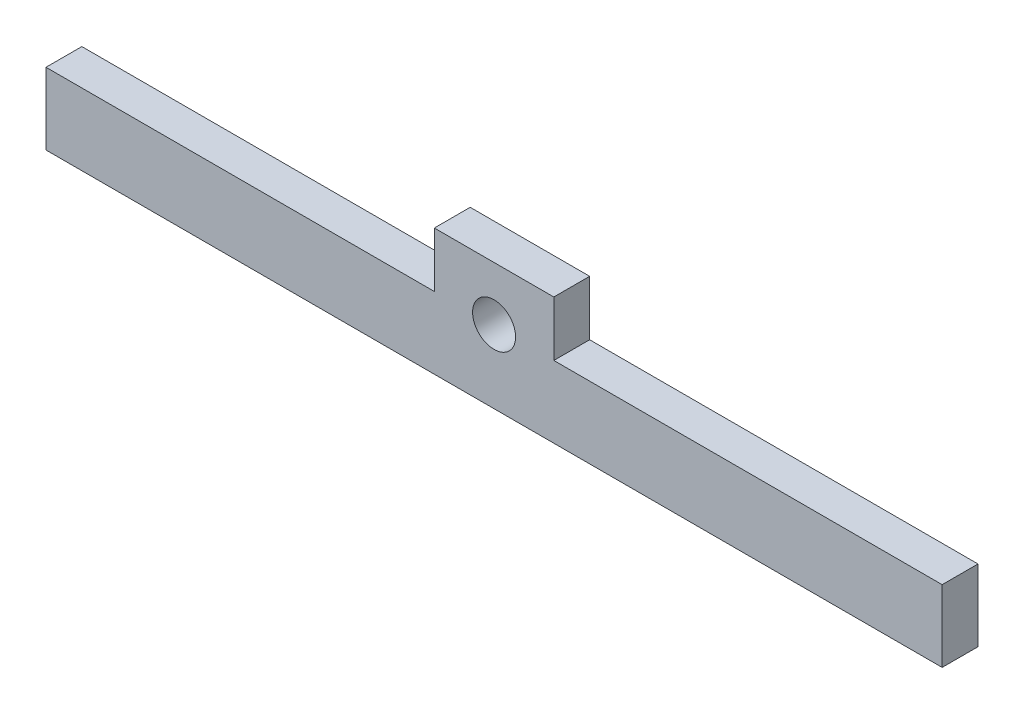
ISO-10303-21;
HEADER;
FILE_DESCRIPTION(('STEP AP214'),'2;1');
FILE_NAME('part.step','',(''),(''),'','','');
FILE_SCHEMA(('AUTOMOTIVE_DESIGN { 1 0 10303 214 1 1 1 1 }'));
ENDSEC;
DATA;
#1=APPLICATION_CONTEXT('core data for automotive mechanical design processes');
#2=APPLICATION_PROTOCOL_DEFINITION('international standard','automotive_design',2000,#1);
#3=PRODUCT_CONTEXT('',#1,'mechanical');
#4=PRODUCT('Part','Part','',(#3));
#5=PRODUCT_RELATED_PRODUCT_CATEGORY('part','',(#4));
#6=PRODUCT_DEFINITION_FORMATION('','',#4);
#7=PRODUCT_DEFINITION_CONTEXT('part definition',#1,'design');
#8=PRODUCT_DEFINITION('design','',#6,#7);
#9=PRODUCT_DEFINITION_SHAPE('','',#8);
#10=(LENGTH_UNIT() NAMED_UNIT(*) SI_UNIT(.MILLI.,.METRE.));
#11=(NAMED_UNIT(*) PLANE_ANGLE_UNIT() SI_UNIT($,.RADIAN.));
#12=(NAMED_UNIT(*) SI_UNIT($,.STERADIAN.) SOLID_ANGLE_UNIT());
#13=UNCERTAINTY_MEASURE_WITH_UNIT(LENGTH_MEASURE(1.E-05),#10,'distance_accuracy_value','');
#14=(GEOMETRIC_REPRESENTATION_CONTEXT(3) GLOBAL_UNCERTAINTY_ASSIGNED_CONTEXT((#13)) GLOBAL_UNIT_ASSIGNED_CONTEXT((#10,
#11,#12)) REPRESENTATION_CONTEXT('',''));
#15=CARTESIAN_POINT('',(0.,0.,0.));
#16=DIRECTION('',(0.,0.,1.));
#17=DIRECTION('',(1.,0.,0.));
#18=AXIS2_PLACEMENT_3D('',#15,#16,#17);
#19=CARTESIAN_POINT('',(0.,0.,15.));
#20=DIRECTION('',(0.,0.,-1.));
#21=DIRECTION('',(-1.,0.,0.));
#22=AXIS2_PLACEMENT_3D('',#19,#20,#21);
#23=PLANE('',#22);
#24=DIRECTION('',(0.,1.,0.));
#25=VECTOR('',#24,1.);
#26=CARTESIAN_POINT('',(25.,30.,15.));
#27=LINE('',#26,#25);
#28=CARTESIAN_POINT('',(25.,30.,15.));
#29=VERTEX_POINT('',#28);
#30=CARTESIAN_POINT('',(25.,53.,15.));
#31=VERTEX_POINT('',#30);
#32=EDGE_CURVE('E145',#29,#31,#27,.T.);
#33=ORIENTED_EDGE('',*,*,#32,.T.);
#34=DIRECTION('',(-1.,0.,0.));
#35=VECTOR('',#34,1.);
#36=CARTESIAN_POINT('',(-25.,53.,15.));
#37=LINE('',#36,#35);
#38=CARTESIAN_POINT('',(-25.,53.,15.));
#39=VERTEX_POINT('',#38);
#40=EDGE_CURVE('E93',#31,#39,#37,.T.);
#41=ORIENTED_EDGE('',*,*,#40,.T.);
#42=DIRECTION('',(0.,-1.,0.));
#43=VECTOR('',#42,1.);
#44=CARTESIAN_POINT('',(-25.,30.,15.));
#45=LINE('',#44,#43);
#46=CARTESIAN_POINT('',(-25.,30.,15.));
#47=VERTEX_POINT('',#46);
#48=EDGE_CURVE('E160',#39,#47,#45,.T.);
#49=ORIENTED_EDGE('',*,*,#48,.T.);
#50=DIRECTION('',(-1.,0.,0.));
#51=VECTOR('',#50,1.);
#52=CARTESIAN_POINT('',(-25.,30.,15.));
#53=LINE('',#52,#51);
#54=CARTESIAN_POINT('',(-187.5,30.,15.));
#55=VERTEX_POINT('',#54);
#56=EDGE_CURVE('E173',#47,#55,#53,.T.);
#57=ORIENTED_EDGE('',*,*,#56,.T.);
#58=DIRECTION('',(0.,-1.,0.));
#59=VECTOR('',#58,1.);
#60=CARTESIAN_POINT('',(-187.5,0.,15.));
#61=LINE('',#60,#59);
#62=CARTESIAN_POINT('',(-187.5,0.,15.));
#63=VERTEX_POINT('',#62);
#64=EDGE_CURVE('E112',#55,#63,#61,.T.);
#65=ORIENTED_EDGE('',*,*,#64,.T.);
#66=DIRECTION('',(1.,0.,0.));
#67=VECTOR('',#66,1.);
#68=CARTESIAN_POINT('',(-187.5,0.,15.));
#69=LINE('',#68,#67);
#70=CARTESIAN_POINT('',(187.5,0.,15.));
#71=VERTEX_POINT('',#70);
#72=EDGE_CURVE('E106',#63,#71,#69,.T.);
#73=ORIENTED_EDGE('',*,*,#72,.T.);
#74=DIRECTION('',(0.,1.,0.));
#75=VECTOR('',#74,1.);
#76=CARTESIAN_POINT('',(187.5,0.,15.));
#77=LINE('',#76,#75);
#78=CARTESIAN_POINT('',(187.5,30.,15.));
#79=VERTEX_POINT('',#78);
#80=EDGE_CURVE('E110',#71,#79,#77,.T.);
#81=ORIENTED_EDGE('',*,*,#80,.T.);
#82=DIRECTION('',(-1.,0.,0.));
#83=VECTOR('',#82,1.);
#84=CARTESIAN_POINT('',(25.,30.,15.));
#85=LINE('',#84,#83);
#86=EDGE_CURVE('E50',#79,#29,#85,.T.);
#87=ORIENTED_EDGE('',*,*,#86,.T.);
#88=EDGE_LOOP('',(#33,#41,#49,#57,#65,#73,#81,#87));
#89=FACE_BOUND('',#88,.T.);
#90=CARTESIAN_POINT('',(0.,30.5,15.));
#91=DIRECTION('',(0.,0.,1.));
#92=DIRECTION('',(1.,0.,0.));
#93=AXIS2_PLACEMENT_3D('',#90,#91,#92);
#94=CIRCLE('',#93,9.);
#95=CARTESIAN_POINT('',(9.,30.5,15.));
#96=VERTEX_POINT('',#95);
#97=EDGE_CURVE('E134',#96,#96,#94,.T.);
#98=ORIENTED_EDGE('',*,*,#97,.F.);
#99=EDGE_LOOP('',(#98));
#100=FACE_BOUND('',#99,.T.);
#101=ADVANCED_FACE('F33',(#89,#100),#23,.F.);
#102=CARTESIAN_POINT('',(0.,0.,0.));
#103=DIRECTION('',(0.,0.,-1.));
#104=DIRECTION('',(-1.,0.,0.));
#105=AXIS2_PLACEMENT_3D('',#102,#103,#104);
#106=PLANE('',#105);
#107=DIRECTION('',(0.,1.,0.));
#108=VECTOR('',#107,1.);
#109=CARTESIAN_POINT('',(25.,30.,0.));
#110=LINE('',#109,#108);
#111=CARTESIAN_POINT('',(25.,30.,0.));
#112=VERTEX_POINT('',#111);
#113=CARTESIAN_POINT('',(25.,53.,0.));
#114=VERTEX_POINT('',#113);
#115=EDGE_CURVE('E130',#112,#114,#110,.T.);
#116=ORIENTED_EDGE('',*,*,#115,.F.);
#117=DIRECTION('',(-1.,0.,0.));
#118=VECTOR('',#117,1.);
#119=CARTESIAN_POINT('',(25.,30.,0.));
#120=LINE('',#119,#118);
#121=CARTESIAN_POINT('',(187.5,30.,0.));
#122=VERTEX_POINT('',#121);
#123=EDGE_CURVE('E85',#122,#112,#120,.T.);
#124=ORIENTED_EDGE('',*,*,#123,.F.);
#125=DIRECTION('',(0.,1.,0.));
#126=VECTOR('',#125,1.);
#127=CARTESIAN_POINT('',(187.5,0.,0.));
#128=LINE('',#127,#126);
#129=CARTESIAN_POINT('',(187.5,0.,0.));
#130=VERTEX_POINT('',#129);
#131=EDGE_CURVE('E79',#130,#122,#128,.T.);
#132=ORIENTED_EDGE('',*,*,#131,.F.);
#133=DIRECTION('',(1.,0.,0.));
#134=VECTOR('',#133,1.);
#135=CARTESIAN_POINT('',(-187.5,0.,0.));
#136=LINE('',#135,#134);
#137=CARTESIAN_POINT('',(-187.5,0.,0.));
#138=VERTEX_POINT('',#137);
#139=EDGE_CURVE('E120',#138,#130,#136,.T.);
#140=ORIENTED_EDGE('',*,*,#139,.F.);
#141=DIRECTION('',(0.,-1.,0.));
#142=VECTOR('',#141,1.);
#143=CARTESIAN_POINT('',(-187.5,0.,0.));
#144=LINE('',#143,#142);
#145=CARTESIAN_POINT('',(-187.5,30.,0.));
#146=VERTEX_POINT('',#145);
#147=EDGE_CURVE('E140',#146,#138,#144,.T.);
#148=ORIENTED_EDGE('',*,*,#147,.F.);
#149=DIRECTION('',(-1.,0.,0.));
#150=VECTOR('',#149,1.);
#151=CARTESIAN_POINT('',(-25.,30.,0.));
#152=LINE('',#151,#150);
#153=CARTESIAN_POINT('',(-25.,30.,0.));
#154=VERTEX_POINT('',#153);
#155=EDGE_CURVE('E138',#154,#146,#152,.T.);
#156=ORIENTED_EDGE('',*,*,#155,.F.);
#157=DIRECTION('',(0.,-1.,0.));
#158=VECTOR('',#157,1.);
#159=CARTESIAN_POINT('',(-25.,30.,0.));
#160=LINE('',#159,#158);
#161=CARTESIAN_POINT('',(-25.,53.,0.));
#162=VERTEX_POINT('',#161);
#163=EDGE_CURVE('E136',#162,#154,#160,.T.);
#164=ORIENTED_EDGE('',*,*,#163,.F.);
#165=DIRECTION('',(-1.,0.,0.));
#166=VECTOR('',#165,1.);
#167=CARTESIAN_POINT('',(-25.,53.,0.));
#168=LINE('',#167,#166);
#169=EDGE_CURVE('E133',#114,#162,#168,.T.);
#170=ORIENTED_EDGE('',*,*,#169,.F.);
#171=EDGE_LOOP('',(#116,#124,#132,#140,#148,#156,#164,#170));
#172=FACE_BOUND('',#171,.T.);
#173=CARTESIAN_POINT('',(0.,30.5,0.));
#174=DIRECTION('',(0.,0.,1.));
#175=DIRECTION('',(1.,0.,0.));
#176=AXIS2_PLACEMENT_3D('',#173,#174,#175);
#177=CIRCLE('',#176,9.);
#178=CARTESIAN_POINT('',(9.,30.5,0.));
#179=VERTEX_POINT('',#178);
#180=EDGE_CURVE('E179',#179,#179,#177,.T.);
#181=ORIENTED_EDGE('',*,*,#180,.T.);
#182=EDGE_LOOP('',(#181));
#183=FACE_BOUND('',#182,.T.);
#184=ADVANCED_FACE('F164',(#172,#183),#106,.T.);
#185=CARTESIAN_POINT('',(25.,30.,15.));
#186=DIRECTION('',(-1.,0.,0.));
#187=DIRECTION('',(0.,0.,1.));
#188=AXIS2_PLACEMENT_3D('',#185,#186,#187);
#189=PLANE('',#188);
#190=ORIENTED_EDGE('',*,*,#115,.T.);
#191=DIRECTION('',(0.,0.,-1.));
#192=VECTOR('',#191,1.);
#193=CARTESIAN_POINT('',(25.,53.,15.));
#194=LINE('',#193,#192);
#195=EDGE_CURVE('E11',#31,#114,#194,.T.);
#196=ORIENTED_EDGE('',*,*,#195,.F.);
#197=ORIENTED_EDGE('',*,*,#32,.F.);
#198=DIRECTION('',(0.,0.,-1.));
#199=VECTOR('',#198,1.);
#200=CARTESIAN_POINT('',(25.,30.,15.));
#201=LINE('',#200,#199);
#202=EDGE_CURVE('E126',#29,#112,#201,.T.);
#203=ORIENTED_EDGE('',*,*,#202,.T.);
#204=EDGE_LOOP('',(#190,#196,#197,#203));
#205=FACE_BOUND('',#204,.T.);
#206=ADVANCED_FACE('F35',(#205),#189,.F.);
#207=CARTESIAN_POINT('',(-25.,53.,15.));
#208=DIRECTION('',(0.,-1.,0.));
#209=DIRECTION('',(0.,0.,-1.));
#210=AXIS2_PLACEMENT_3D('',#207,#208,#209);
#211=PLANE('',#210);
#212=ORIENTED_EDGE('',*,*,#169,.T.);
#213=DIRECTION('',(0.,0.,-1.));
#214=VECTOR('',#213,1.);
#215=CARTESIAN_POINT('',(-25.,53.,15.));
#216=LINE('',#215,#214);
#217=EDGE_CURVE('E42',#39,#162,#216,.T.);
#218=ORIENTED_EDGE('',*,*,#217,.F.);
#219=ORIENTED_EDGE('',*,*,#40,.F.);
#220=ORIENTED_EDGE('',*,*,#195,.T.);
#221=EDGE_LOOP('',(#212,#218,#219,#220));
#222=FACE_BOUND('',#221,.T.);
#223=ADVANCED_FACE('F207',(#222),#211,.F.);
#224=CARTESIAN_POINT('',(-25.,30.,15.));
#225=DIRECTION('',(1.,0.,0.));
#226=DIRECTION('',(0.,0.,-1.));
#227=AXIS2_PLACEMENT_3D('',#224,#225,#226);
#228=PLANE('',#227);
#229=ORIENTED_EDGE('',*,*,#163,.T.);
#230=DIRECTION('',(0.,0.,-1.));
#231=VECTOR('',#230,1.);
#232=CARTESIAN_POINT('',(-25.,30.,15.));
#233=LINE('',#232,#231);
#234=EDGE_CURVE('E152',#47,#154,#233,.T.);
#235=ORIENTED_EDGE('',*,*,#234,.F.);
#236=ORIENTED_EDGE('',*,*,#48,.F.);
#237=ORIENTED_EDGE('',*,*,#217,.T.);
#238=EDGE_LOOP('',(#229,#235,#236,#237));
#239=FACE_BOUND('',#238,.T.);
#240=ADVANCED_FACE('F158',(#239),#228,.F.);
#241=CARTESIAN_POINT('',(-25.,30.,15.));
#242=DIRECTION('',(0.,-1.,0.));
#243=DIRECTION('',(1.,0.,0.));
#244=AXIS2_PLACEMENT_3D('',#241,#242,#243);
#245=PLANE('',#244);
#246=ORIENTED_EDGE('',*,*,#155,.T.);
#247=DIRECTION('',(0.,0.,-1.));
#248=VECTOR('',#247,1.);
#249=CARTESIAN_POINT('',(-187.5,30.,15.));
#250=LINE('',#249,#248);
#251=EDGE_CURVE('E149',#55,#146,#250,.T.);
#252=ORIENTED_EDGE('',*,*,#251,.F.);
#253=ORIENTED_EDGE('',*,*,#56,.F.);
#254=ORIENTED_EDGE('',*,*,#234,.T.);
#255=EDGE_LOOP('',(#246,#252,#253,#254));
#256=FACE_BOUND('',#255,.T.);
#257=ADVANCED_FACE('F169',(#256),#245,.F.);
#258=CARTESIAN_POINT('',(-187.5,0.,15.));
#259=DIRECTION('',(1.,0.,0.));
#260=DIRECTION('',(0.,0.,-1.));
#261=AXIS2_PLACEMENT_3D('',#258,#259,#260);
#262=PLANE('',#261);
#263=ORIENTED_EDGE('',*,*,#147,.T.);
#264=DIRECTION('',(0.,0.,-1.));
#265=VECTOR('',#264,1.);
#266=CARTESIAN_POINT('',(-187.5,0.,15.));
#267=LINE('',#266,#265);
#268=EDGE_CURVE('E121',#63,#138,#267,.T.);
#269=ORIENTED_EDGE('',*,*,#268,.F.);
#270=ORIENTED_EDGE('',*,*,#64,.F.);
#271=ORIENTED_EDGE('',*,*,#251,.T.);
#272=EDGE_LOOP('',(#263,#269,#270,#271));
#273=FACE_BOUND('',#272,.T.);
#274=ADVANCED_FACE('F172',(#273),#262,.F.);
#275=CARTESIAN_POINT('',(-187.5,0.,15.));
#276=DIRECTION('',(0.,1.,0.));
#277=DIRECTION('',(0.,0.,1.));
#278=AXIS2_PLACEMENT_3D('',#275,#276,#277);
#279=PLANE('',#278);
#280=ORIENTED_EDGE('',*,*,#139,.T.);
#281=DIRECTION('',(0.,0.,-1.));
#282=VECTOR('',#281,1.);
#283=CARTESIAN_POINT('',(187.5,0.,15.));
#284=LINE('',#283,#282);
#285=EDGE_CURVE('E117',#71,#130,#284,.T.);
#286=ORIENTED_EDGE('',*,*,#285,.F.);
#287=ORIENTED_EDGE('',*,*,#72,.F.);
#288=ORIENTED_EDGE('',*,*,#268,.T.);
#289=EDGE_LOOP('',(#280,#286,#287,#288));
#290=FACE_BOUND('',#289,.T.);
#291=ADVANCED_FACE('F118',(#290),#279,.F.);
#292=CARTESIAN_POINT('',(187.5,0.,15.));
#293=DIRECTION('',(-1.,0.,0.));
#294=DIRECTION('',(0.,0.,1.));
#295=AXIS2_PLACEMENT_3D('',#292,#293,#294);
#296=PLANE('',#295);
#297=ORIENTED_EDGE('',*,*,#131,.T.);
#298=DIRECTION('',(0.,0.,-1.));
#299=VECTOR('',#298,1.);
#300=CARTESIAN_POINT('',(187.5,30.,15.));
#301=LINE('',#300,#299);
#302=EDGE_CURVE('E122',#79,#122,#301,.T.);
#303=ORIENTED_EDGE('',*,*,#302,.F.);
#304=ORIENTED_EDGE('',*,*,#80,.F.);
#305=ORIENTED_EDGE('',*,*,#285,.T.);
#306=EDGE_LOOP('',(#297,#303,#304,#305));
#307=FACE_BOUND('',#306,.T.);
#308=ADVANCED_FACE('F124',(#307),#296,.F.);
#309=CARTESIAN_POINT('',(25.,30.,15.));
#310=DIRECTION('',(0.,-1.,0.));
#311=DIRECTION('',(1.,0.,0.));
#312=AXIS2_PLACEMENT_3D('',#309,#310,#311);
#313=PLANE('',#312);
#314=ORIENTED_EDGE('',*,*,#123,.T.);
#315=ORIENTED_EDGE('',*,*,#202,.F.);
#316=ORIENTED_EDGE('',*,*,#86,.F.);
#317=ORIENTED_EDGE('',*,*,#302,.T.);
#318=EDGE_LOOP('',(#314,#315,#316,#317));
#319=FACE_BOUND('',#318,.T.);
#320=ADVANCED_FACE('F195',(#319),#313,.F.);
#321=CARTESIAN_POINT('',(0.,30.5,15.));
#322=DIRECTION('',(0.,0.,-1.));
#323=DIRECTION('',(-1.,0.,0.));
#324=AXIS2_PLACEMENT_3D('',#321,#322,#323);
#325=CYLINDRICAL_SURFACE('',#324,9.);
#326=ORIENTED_EDGE('',*,*,#97,.T.);
#327=EDGE_LOOP('',(#326));
#328=FACE_BOUND('',#327,.T.);
#329=ORIENTED_EDGE('',*,*,#180,.F.);
#330=EDGE_LOOP('',(#329));
#331=FACE_BOUND('',#330,.T.);
#332=ADVANCED_FACE('F185',(#328,#331),#325,.F.);
#333=CLOSED_SHELL('',(#101,#184,#206,#223,#240,#257,#274,#291,#308,#320,#332));
#334=MANIFOLD_SOLID_BREP('B2',#333);
#335=ADVANCED_BREP_SHAPE_REPRESENTATION('',(#18,#334),#14);
#336=SHAPE_DEFINITION_REPRESENTATION(#9,#335);
ENDSEC;
END-ISO-10303-21;
